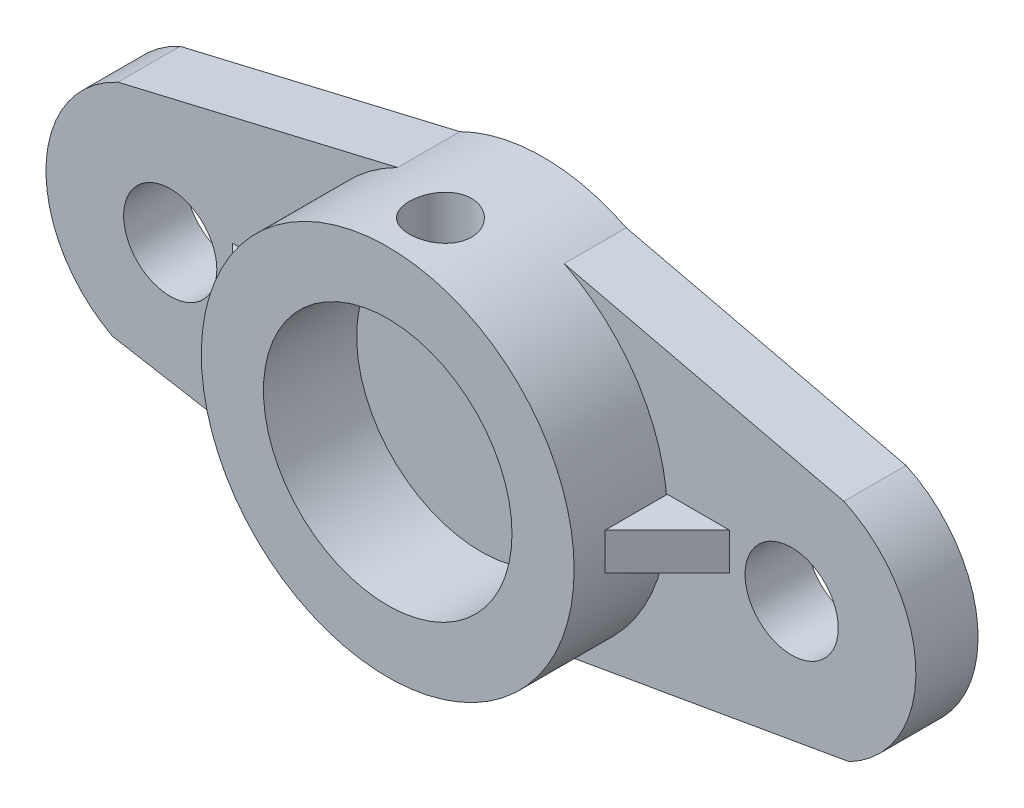
ISO-10303-21;
HEADER;
FILE_DESCRIPTION(('STEP AP214'),'2;1');
FILE_NAME('part.step','',(''),(''),'','','');
FILE_SCHEMA(('AUTOMOTIVE_DESIGN { 1 0 10303 214 1 1 1 1 }'));
ENDSEC;
DATA;
#1=APPLICATION_CONTEXT('core data for automotive mechanical design processes');
#2=APPLICATION_PROTOCOL_DEFINITION('international standard','automotive_design',2000,#1);
#3=PRODUCT_CONTEXT('',#1,'mechanical');
#4=PRODUCT('Part','Part','',(#3));
#5=PRODUCT_RELATED_PRODUCT_CATEGORY('part','',(#4));
#6=PRODUCT_DEFINITION_FORMATION('','',#4);
#7=PRODUCT_DEFINITION_CONTEXT('part definition',#1,'design');
#8=PRODUCT_DEFINITION('design','',#6,#7);
#9=PRODUCT_DEFINITION_SHAPE('','',#8);
#10=(LENGTH_UNIT() NAMED_UNIT(*) SI_UNIT(.MILLI.,.METRE.));
#11=(NAMED_UNIT(*) PLANE_ANGLE_UNIT() SI_UNIT($,.RADIAN.));
#12=(NAMED_UNIT(*) SI_UNIT($,.STERADIAN.) SOLID_ANGLE_UNIT());
#13=UNCERTAINTY_MEASURE_WITH_UNIT(LENGTH_MEASURE(1.E-05),#10,'distance_accuracy_value','');
#14=(GEOMETRIC_REPRESENTATION_CONTEXT(3) GLOBAL_UNCERTAINTY_ASSIGNED_CONTEXT((#13)) GLOBAL_UNIT_ASSIGNED_CONTEXT((#10,
#11,#12)) REPRESENTATION_CONTEXT('',''));
#15=CARTESIAN_POINT('',(0.,0.,0.));
#16=DIRECTION('',(0.,0.,1.));
#17=DIRECTION('',(1.,0.,0.));
#18=AXIS2_PLACEMENT_3D('',#15,#16,#17);
#19=CARTESIAN_POINT('',(30.,3.,10.));
#20=DIRECTION('',(1.,0.,0.));
#21=DIRECTION('',(0.,0.,-1.));
#22=AXIS2_PLACEMENT_3D('',#19,#20,#21);
#23=PLANE('',#22);
#24=DIRECTION('',(0.,0.,1.));
#25=VECTOR('',#24,1.);
#26=CARTESIAN_POINT('',(30.,-3.,10.));
#27=LINE('',#26,#25);
#28=CARTESIAN_POINT('',(30.,-3.,10.));
#29=VERTEX_POINT('',#28);
#30=CARTESIAN_POINT('',(30.,-3.,20.));
#31=VERTEX_POINT('',#30);
#32=EDGE_CURVE('E95',#29,#31,#27,.T.);
#33=ORIENTED_EDGE('',*,*,#32,.T.);
#34=DIRECTION('',(0.,-1.,0.));
#35=VECTOR('',#34,1.);
#36=CARTESIAN_POINT('',(30.,3.,20.));
#37=LINE('',#36,#35);
#38=CARTESIAN_POINT('',(30.,3.,20.));
#39=VERTEX_POINT('',#38);
#40=EDGE_CURVE('E12',#39,#31,#37,.T.);
#41=ORIENTED_EDGE('',*,*,#40,.F.);
#42=DIRECTION('',(0.,0.,1.));
#43=VECTOR('',#42,1.);
#44=CARTESIAN_POINT('',(30.,3.,10.));
#45=LINE('',#44,#43);
#46=CARTESIAN_POINT('',(30.,3.,10.));
#47=VERTEX_POINT('',#46);
#48=EDGE_CURVE('E88',#47,#39,#45,.T.);
#49=ORIENTED_EDGE('',*,*,#48,.F.);
#50=DIRECTION('',(0.,-1.,0.));
#51=VECTOR('',#50,1.);
#52=CARTESIAN_POINT('',(30.,3.,10.));
#53=LINE('',#52,#51);
#54=EDGE_CURVE('E96',#47,#29,#53,.T.);
#55=ORIENTED_EDGE('',*,*,#54,.T.);
#56=EDGE_LOOP('',(#33,#41,#49,#55));
#57=FACE_BOUND('',#56,.T.);
#58=ADVANCED_FACE('F48',(#57),#23,.F.);
#59=CARTESIAN_POINT('',(30.,3.,20.));
#60=DIRECTION('',(-0.707106781186547,0.,-0.707106781186548));
#61=DIRECTION('',(-0.707106781186548,0.,0.707106781186547));
#62=AXIS2_PLACEMENT_3D('',#59,#60,#61);
#63=PLANE('',#62);
#64=DIRECTION('',(0.707106781186548,0.,-0.707106781186547));
#65=VECTOR('',#64,1.);
#66=CARTESIAN_POINT('',(30.,-3.,20.));
#67=LINE('',#66,#65);
#68=CARTESIAN_POINT('',(40.,-3.,10.));
#69=VERTEX_POINT('',#68);
#70=EDGE_CURVE('E76',#31,#69,#67,.T.);
#71=ORIENTED_EDGE('',*,*,#70,.T.);
#72=DIRECTION('',(0.,-1.,0.));
#73=VECTOR('',#72,1.);
#74=CARTESIAN_POINT('',(40.,3.,10.));
#75=LINE('',#74,#73);
#76=CARTESIAN_POINT('',(40.,3.,10.));
#77=VERTEX_POINT('',#76);
#78=EDGE_CURVE('E56',#77,#69,#75,.T.);
#79=ORIENTED_EDGE('',*,*,#78,.F.);
#80=DIRECTION('',(0.707106781186548,0.,-0.707106781186547));
#81=VECTOR('',#80,1.);
#82=CARTESIAN_POINT('',(30.,3.,20.));
#83=LINE('',#82,#81);
#84=EDGE_CURVE('E84',#39,#77,#83,.T.);
#85=ORIENTED_EDGE('',*,*,#84,.F.);
#86=ORIENTED_EDGE('',*,*,#40,.T.);
#87=EDGE_LOOP('',(#71,#79,#85,#86));
#88=FACE_BOUND('',#87,.T.);
#89=ADVANCED_FACE('F85',(#88),#63,.F.);
#90=CARTESIAN_POINT('',(40.,3.,10.));
#91=DIRECTION('',(0.,0.,1.));
#92=DIRECTION('',(1.,0.,0.));
#93=AXIS2_PLACEMENT_3D('',#90,#91,#92);
#94=PLANE('',#93);
#95=DIRECTION('',(-1.,0.,0.));
#96=VECTOR('',#95,1.);
#97=CARTESIAN_POINT('',(40.,-3.,10.));
#98=LINE('',#97,#96);
#99=EDGE_CURVE('E81',#69,#29,#98,.T.);
#100=ORIENTED_EDGE('',*,*,#99,.T.);
#101=ORIENTED_EDGE('',*,*,#54,.F.);
#102=DIRECTION('',(-1.,0.,0.));
#103=VECTOR('',#102,1.);
#104=CARTESIAN_POINT('',(40.,3.,10.));
#105=LINE('',#104,#103);
#106=EDGE_CURVE('E64',#77,#47,#105,.T.);
#107=ORIENTED_EDGE('',*,*,#106,.F.);
#108=ORIENTED_EDGE('',*,*,#78,.T.);
#109=EDGE_LOOP('',(#100,#101,#107,#108));
#110=FACE_BOUND('',#109,.T.);
#111=ADVANCED_FACE('F103',(#110),#94,.F.);
#112=CARTESIAN_POINT('',(0.,3.,0.));
#113=DIRECTION('',(0.,-1.,0.));
#114=DIRECTION('',(0.,0.,-1.));
#115=AXIS2_PLACEMENT_3D('',#112,#113,#114);
#116=PLANE('',#115);
#117=ORIENTED_EDGE('',*,*,#48,.T.);
#118=ORIENTED_EDGE('',*,*,#84,.T.);
#119=ORIENTED_EDGE('',*,*,#106,.T.);
#120=EDGE_LOOP('',(#117,#118,#119));
#121=FACE_BOUND('',#120,.T.);
#122=ADVANCED_FACE('F91',(#121),#116,.F.);
#123=CARTESIAN_POINT('',(0.,-3.,0.));
#124=DIRECTION('',(0.,-1.,0.));
#125=DIRECTION('',(0.,0.,-1.));
#126=AXIS2_PLACEMENT_3D('',#123,#124,#125);
#127=PLANE('',#126);
#128=ORIENTED_EDGE('',*,*,#32,.F.);
#129=ORIENTED_EDGE('',*,*,#99,.F.);
#130=ORIENTED_EDGE('',*,*,#70,.F.);
#131=EDGE_LOOP('',(#128,#129,#130));
#132=FACE_BOUND('',#131,.T.);
#133=ADVANCED_FACE('F104',(#132),#127,.T.);
#134=CLOSED_SHELL('',(#58,#89,#111,#122,#133));
#135=MANIFOLD_SOLID_BREP('B2',#134);
#136=CARTESIAN_POINT('',(-40.,3.,10.));
#137=DIRECTION('',(0.,0.,1.));
#138=DIRECTION('',(1.,0.,0.));
#139=AXIS2_PLACEMENT_3D('',#136,#137,#138);
#140=PLANE('',#139);
#141=DIRECTION('',(-1.,0.,0.));
#142=VECTOR('',#141,1.);
#143=CARTESIAN_POINT('',(-40.,-3.,10.));
#144=LINE('',#143,#142);
#145=CARTESIAN_POINT('',(-30.,-3.,10.));
#146=VERTEX_POINT('',#145);
#147=CARTESIAN_POINT('',(-40.,-3.,10.));
#148=VERTEX_POINT('',#147);
#149=EDGE_CURVE('E202',#146,#148,#144,.T.);
#150=ORIENTED_EDGE('',*,*,#149,.T.);
#151=DIRECTION('',(0.,-1.,0.));
#152=VECTOR('',#151,1.);
#153=CARTESIAN_POINT('',(-40.,3.,10.));
#154=LINE('',#153,#152);
#155=CARTESIAN_POINT('',(-40.,3.,10.));
#156=VERTEX_POINT('',#155);
#157=EDGE_CURVE('E46',#156,#148,#154,.T.);
#158=ORIENTED_EDGE('',*,*,#157,.F.);
#159=DIRECTION('',(-1.,0.,0.));
#160=VECTOR('',#159,1.);
#161=CARTESIAN_POINT('',(-40.,3.,10.));
#162=LINE('',#161,#160);
#163=CARTESIAN_POINT('',(-30.,3.,10.));
#164=VERTEX_POINT('',#163);
#165=EDGE_CURVE('E195',#164,#156,#162,.T.);
#166=ORIENTED_EDGE('',*,*,#165,.F.);
#167=DIRECTION('',(0.,-1.,0.));
#168=VECTOR('',#167,1.);
#169=CARTESIAN_POINT('',(-30.,3.,10.));
#170=LINE('',#169,#168);
#171=EDGE_CURVE('E203',#164,#146,#170,.T.);
#172=ORIENTED_EDGE('',*,*,#171,.T.);
#173=EDGE_LOOP('',(#150,#158,#166,#172));
#174=FACE_BOUND('',#173,.T.);
#175=ADVANCED_FACE('F155',(#174),#140,.F.);
#176=CARTESIAN_POINT('',(-30.,3.,20.));
#177=DIRECTION('',(0.707106781186547,0.,-0.707106781186548));
#178=DIRECTION('',(-0.707106781186548,0.,-0.707106781186547));
#179=AXIS2_PLACEMENT_3D('',#176,#177,#178);
#180=PLANE('',#179);
#181=DIRECTION('',(0.707106781186548,0.,0.707106781186547));
#182=VECTOR('',#181,1.);
#183=CARTESIAN_POINT('',(-30.,-3.,20.));
#184=LINE('',#183,#182);
#185=CARTESIAN_POINT('',(-30.,-3.,20.));
#186=VERTEX_POINT('',#185);
#187=EDGE_CURVE('E183',#148,#186,#184,.T.);
#188=ORIENTED_EDGE('',*,*,#187,.T.);
#189=DIRECTION('',(0.,-1.,0.));
#190=VECTOR('',#189,1.);
#191=CARTESIAN_POINT('',(-30.,3.,20.));
#192=LINE('',#191,#190);
#193=CARTESIAN_POINT('',(-30.,3.,20.));
#194=VERTEX_POINT('',#193);
#195=EDGE_CURVE('E163',#194,#186,#192,.T.);
#196=ORIENTED_EDGE('',*,*,#195,.F.);
#197=DIRECTION('',(0.707106781186548,0.,0.707106781186547));
#198=VECTOR('',#197,1.);
#199=CARTESIAN_POINT('',(-30.,3.,20.));
#200=LINE('',#199,#198);
#201=EDGE_CURVE('E191',#156,#194,#200,.T.);
#202=ORIENTED_EDGE('',*,*,#201,.F.);
#203=ORIENTED_EDGE('',*,*,#157,.T.);
#204=EDGE_LOOP('',(#188,#196,#202,#203));
#205=FACE_BOUND('',#204,.T.);
#206=ADVANCED_FACE('F192',(#205),#180,.F.);
#207=CARTESIAN_POINT('',(-30.,3.,10.));
#208=DIRECTION('',(-1.,0.,0.));
#209=DIRECTION('',(0.,0.,1.));
#210=AXIS2_PLACEMENT_3D('',#207,#208,#209);
#211=PLANE('',#210);
#212=DIRECTION('',(0.,0.,-1.));
#213=VECTOR('',#212,1.);
#214=CARTESIAN_POINT('',(-30.,-3.,10.));
#215=LINE('',#214,#213);
#216=EDGE_CURVE('E188',#186,#146,#215,.T.);
#217=ORIENTED_EDGE('',*,*,#216,.T.);
#218=ORIENTED_EDGE('',*,*,#171,.F.);
#219=DIRECTION('',(0.,0.,-1.));
#220=VECTOR('',#219,1.);
#221=CARTESIAN_POINT('',(-30.,3.,10.));
#222=LINE('',#221,#220);
#223=EDGE_CURVE('E171',#194,#164,#222,.T.);
#224=ORIENTED_EDGE('',*,*,#223,.F.);
#225=ORIENTED_EDGE('',*,*,#195,.T.);
#226=EDGE_LOOP('',(#217,#218,#224,#225));
#227=FACE_BOUND('',#226,.T.);
#228=ADVANCED_FACE('F210',(#227),#211,.F.);
#229=CARTESIAN_POINT('',(0.,3.,0.));
#230=DIRECTION('',(0.,-1.,0.));
#231=DIRECTION('',(0.,0.,-1.));
#232=AXIS2_PLACEMENT_3D('',#229,#230,#231);
#233=PLANE('',#232);
#234=ORIENTED_EDGE('',*,*,#165,.T.);
#235=ORIENTED_EDGE('',*,*,#201,.T.);
#236=ORIENTED_EDGE('',*,*,#223,.T.);
#237=EDGE_LOOP('',(#234,#235,#236));
#238=FACE_BOUND('',#237,.T.);
#239=ADVANCED_FACE('F198',(#238),#233,.F.);
#240=CARTESIAN_POINT('',(0.,-3.,0.));
#241=DIRECTION('',(0.,-1.,0.));
#242=DIRECTION('',(0.,0.,-1.));
#243=AXIS2_PLACEMENT_3D('',#240,#241,#242);
#244=PLANE('',#243);
#245=ORIENTED_EDGE('',*,*,#149,.F.);
#246=ORIENTED_EDGE('',*,*,#216,.F.);
#247=ORIENTED_EDGE('',*,*,#187,.F.);
#248=EDGE_LOOP('',(#245,#246,#247));
#249=FACE_BOUND('',#248,.T.);
#250=ADVANCED_FACE('F211',(#249),#244,.T.);
#251=CLOSED_SHELL('',(#175,#206,#228,#239,#250));
#252=MANIFOLD_SOLID_BREP('B6',#251);
#253=CARTESIAN_POINT('',(0.,0.,10.));
#254=DIRECTION('',(0.,0.,1.));
#255=DIRECTION('',(1.,0.,0.));
#256=AXIS2_PLACEMENT_3D('',#253,#254,#255);
#257=PLANE('',#256);
#258=CARTESIAN_POINT('',(0.,0.,10.));
#259=DIRECTION('',(0.,0.,1.));
#260=DIRECTION('',(1.,0.,0.));
#261=AXIS2_PLACEMENT_3D('',#258,#259,#260);
#262=CIRCLE('',#261,30.);
#263=CARTESIAN_POINT('',(-13.4020982789799,26.8399657548322,10.));
#264=VERTEX_POINT('',#263);
#265=CARTESIAN_POINT('',(-10.1784328422696,-28.2205511086408,10.));
#266=VERTEX_POINT('',#265);
#267=EDGE_CURVE('E153',#264,#266,#262,.T.);
#268=ORIENTED_EDGE('',*,*,#267,.F.);
#269=DIRECTION('',(-0.973310208813478,-0.229493436549858,0.));
#270=VECTOR('',#269,1.);
#271=CARTESIAN_POINT('',(-6.70104913948995,28.4199828774161,10.));
#272=LINE('',#271,#270);
#273=CARTESIAN_POINT('',(-58.4131273482158,16.2269714081099,10.));
#274=VERTEX_POINT('',#273);
#275=EDGE_CURVE('E403',#264,#274,#272,.T.);
#276=ORIENTED_EDGE('',*,*,#275,.T.);
#277=CARTESIAN_POINT('',(-50.,-1.91742960770493,10.));
#278=DIRECTION('',(0.,0.,1.));
#279=DIRECTION('',(1.,0.,0.));
#280=AXIS2_PLACEMENT_3D('',#277,#278,#279);
#281=CIRCLE('',#280,20.);
#282=CARTESIAN_POINT('',(-59.2736487800074,-19.6374589052278,10.));
#283=VERTEX_POINT('',#282);
#284=EDGE_CURVE('E318',#274,#283,#281,.T.);
#285=ORIENTED_EDGE('',*,*,#284,.T.);
#286=DIRECTION('',(0.985059652243125,-0.172213476599983,0.));
#287=VECTOR('',#286,1.);
#288=CARTESIAN_POINT('',(-5.08921642113477,-29.1102755543204,10.));
#289=LINE('',#288,#287);
#290=EDGE_CURVE('E351',#283,#266,#289,.T.);
#291=ORIENTED_EDGE('',*,*,#290,.T.);
#292=EDGE_LOOP('',(#268,#276,#285,#291));
#293=FACE_BOUND('',#292,.T.);
#294=CARTESIAN_POINT('',(-50.,-1.91742960770493,10.));
#295=DIRECTION('',(0.,0.,1.));
#296=DIRECTION('',(1.,0.,0.));
#297=AXIS2_PLACEMENT_3D('',#294,#295,#296);
#298=CIRCLE('',#297,7.5);
#299=CARTESIAN_POINT('',(-42.5,-1.91742960770493,10.));
#300=VERTEX_POINT('',#299);
#301=EDGE_CURVE('E386',#300,#300,#298,.T.);
#302=ORIENTED_EDGE('',*,*,#301,.F.);
#303=EDGE_LOOP('',(#302));
#304=FACE_BOUND('',#303,.T.);
#305=ADVANCED_FACE('F253',(#293,#304),#257,.T.);
#306=CARTESIAN_POINT('',(-6.70104913948995,28.4199828774161,10.));
#307=DIRECTION('',(0.229493436549858,-0.973310208813478,0.));
#308=DIRECTION('',(0.973310208813478,0.229493436549858,0.));
#309=AXIS2_PLACEMENT_3D('',#306,#307,#308);
#310=PLANE('',#309);
#311=DIRECTION('',(-0.973310208813478,-0.229493436549858,0.));
#312=VECTOR('',#311,1.);
#313=CARTESIAN_POINT('',(-6.70104913948995,28.4199828774161,0.));
#314=LINE('',#313,#312);
#315=CARTESIAN_POINT('',(-13.4020982789799,26.8399657548322,0.));
#316=VERTEX_POINT('',#315);
#317=CARTESIAN_POINT('',(-58.4131273482158,16.2269714081099,0.));
#318=VERTEX_POINT('',#317);
#319=EDGE_CURVE('E366',#316,#318,#314,.T.);
#320=ORIENTED_EDGE('',*,*,#319,.T.);
#321=DIRECTION('',(0.,0.,-1.));
#322=VECTOR('',#321,1.);
#323=CARTESIAN_POINT('',(-58.4131273482158,16.2269714081099,10.));
#324=LINE('',#323,#322);
#325=EDGE_CURVE('E396',#274,#318,#324,.T.);
#326=ORIENTED_EDGE('',*,*,#325,.F.);
#327=ORIENTED_EDGE('',*,*,#275,.F.);
#328=DIRECTION('',(0.,0.,-1.));
#329=VECTOR('',#328,1.);
#330=CARTESIAN_POINT('',(-13.4020982789799,26.8399657548322,10.));
#331=LINE('',#330,#329);
#332=EDGE_CURVE('E362',#264,#316,#331,.T.);
#333=ORIENTED_EDGE('',*,*,#332,.T.);
#334=EDGE_LOOP('',(#320,#326,#327,#333));
#335=FACE_BOUND('',#334,.T.);
#336=ADVANCED_FACE('F417',(#335),#310,.F.);
#337=CARTESIAN_POINT('',(-50.,-1.91742960770493,10.));
#338=DIRECTION('',(0.,0.,-1.));
#339=DIRECTION('',(-1.,0.,0.));
#340=AXIS2_PLACEMENT_3D('',#337,#338,#339);
#341=CYLINDRICAL_SURFACE('',#340,20.);
#342=CARTESIAN_POINT('',(-50.,-1.91742960770493,0.));
#343=DIRECTION('',(0.,0.,1.));
#344=DIRECTION('',(1.,0.,0.));
#345=AXIS2_PLACEMENT_3D('',#342,#343,#344);
#346=CIRCLE('',#345,20.);
#347=CARTESIAN_POINT('',(-59.2736487800074,-19.6374589052278,0.));
#348=VERTEX_POINT('',#347);
#349=EDGE_CURVE('E370',#318,#348,#346,.T.);
#350=ORIENTED_EDGE('',*,*,#349,.T.);
#351=DIRECTION('',(0.,0.,-1.));
#352=VECTOR('',#351,1.);
#353=CARTESIAN_POINT('',(-59.2736487800074,-19.6374589052278,10.));
#354=LINE('',#353,#352);
#355=EDGE_CURVE('E394',#283,#348,#354,.T.);
#356=ORIENTED_EDGE('',*,*,#355,.F.);
#357=ORIENTED_EDGE('',*,*,#284,.F.);
#358=ORIENTED_EDGE('',*,*,#325,.T.);
#359=EDGE_LOOP('',(#350,#356,#357,#358));
#360=FACE_BOUND('',#359,.T.);
#361=ADVANCED_FACE('F422',(#360),#341,.T.);
#362=CARTESIAN_POINT('',(-5.08921642113477,-29.1102755543204,10.));
#363=DIRECTION('',(0.172213476599983,0.985059652243125,0.));
#364=DIRECTION('',(-0.985059652243125,0.172213476599983,0.));
#365=AXIS2_PLACEMENT_3D('',#362,#363,#364);
#366=PLANE('',#365);
#367=DIRECTION('',(0.985059652243125,-0.172213476599983,0.));
#368=VECTOR('',#367,1.);
#369=CARTESIAN_POINT('',(-5.08921642113477,-29.1102755543204,0.));
#370=LINE('',#369,#368);
#371=CARTESIAN_POINT('',(-10.1784328422696,-28.2205511086408,0.));
#372=VERTEX_POINT('',#371);
#373=EDGE_CURVE('E372',#348,#372,#370,.T.);
#374=ORIENTED_EDGE('',*,*,#373,.T.);
#375=DIRECTION('',(0.,0.,-1.));
#376=VECTOR('',#375,1.);
#377=CARTESIAN_POINT('',(-10.1784328422696,-28.2205511086408,10.));
#378=LINE('',#377,#376);
#379=EDGE_CURVE('E391',#266,#372,#378,.T.);
#380=ORIENTED_EDGE('',*,*,#379,.F.);
#381=ORIENTED_EDGE('',*,*,#290,.F.);
#382=ORIENTED_EDGE('',*,*,#355,.T.);
#383=EDGE_LOOP('',(#374,#380,#381,#382));
#384=FACE_BOUND('',#383,.T.);
#385=ADVANCED_FACE('F409',(#384),#366,.F.);
#386=CARTESIAN_POINT('',(5.08921642113477,-29.1102755543204,10.));
#387=DIRECTION('',(0.172213476599983,-0.985059652243125,0.));
#388=DIRECTION('',(0.985059652243125,0.172213476599983,0.));
#389=AXIS2_PLACEMENT_3D('',#386,#387,#388);
#390=PLANE('',#389);
#391=DIRECTION('',(-0.985059652243125,-0.172213476599983,0.));
#392=VECTOR('',#391,1.);
#393=CARTESIAN_POINT('',(5.08921642113477,-29.1102755543204,0.));
#394=LINE('',#393,#392);
#395=CARTESIAN_POINT('',(59.2736487800074,-19.6374589052278,0.));
#396=VERTEX_POINT('',#395);
#397=CARTESIAN_POINT('',(10.1784328422696,-28.2205511086408,0.));
#398=VERTEX_POINT('',#397);
#399=EDGE_CURVE('E335',#396,#398,#394,.T.);
#400=ORIENTED_EDGE('',*,*,#399,.F.);
#401=DIRECTION('',(0.,0.,-1.));
#402=VECTOR('',#401,1.);
#403=CARTESIAN_POINT('',(59.2736487800074,-19.6374589052278,10.));
#404=LINE('',#403,#402);
#405=CARTESIAN_POINT('',(59.2736487800074,-19.6374589052278,10.));
#406=VERTEX_POINT('',#405);
#407=EDGE_CURVE('E330',#406,#396,#404,.T.);
#408=ORIENTED_EDGE('',*,*,#407,.F.);
#409=DIRECTION('',(-0.985059652243125,-0.172213476599983,0.));
#410=VECTOR('',#409,1.);
#411=CARTESIAN_POINT('',(5.08921642113477,-29.1102755543204,10.));
#412=LINE('',#411,#410);
#413=CARTESIAN_POINT('',(10.1784328422696,-28.2205511086408,10.));
#414=VERTEX_POINT('',#413);
#415=EDGE_CURVE('E333',#406,#414,#412,.T.);
#416=ORIENTED_EDGE('',*,*,#415,.T.);
#417=DIRECTION('',(0.,0.,-1.));
#418=VECTOR('',#417,1.);
#419=CARTESIAN_POINT('',(10.1784328422696,-28.2205511086408,10.));
#420=LINE('',#419,#418);
#421=EDGE_CURVE('E340',#414,#398,#420,.T.);
#422=ORIENTED_EDGE('',*,*,#421,.T.);
#423=EDGE_LOOP('',(#400,#408,#416,#422));
#424=FACE_BOUND('',#423,.T.);
#425=ADVANCED_FACE('F332',(#424),#390,.T.);
#426=CARTESIAN_POINT('',(50.,-1.91742960770493,10.));
#427=DIRECTION('',(0.,0.,-1.));
#428=DIRECTION('',(-1.,0.,0.));
#429=AXIS2_PLACEMENT_3D('',#426,#427,#428);
#430=CYLINDRICAL_SURFACE('',#429,20.);
#431=CARTESIAN_POINT('',(50.,-1.91742960770493,0.));
#432=DIRECTION('',(0.,0.,1.));
#433=DIRECTION('',(1.,0.,0.));
#434=AXIS2_PLACEMENT_3D('',#431,#432,#433);
#435=CIRCLE('',#434,20.);
#436=CARTESIAN_POINT('',(58.4131273482158,16.2269714081099,0.));
#437=VERTEX_POINT('',#436);
#438=EDGE_CURVE('E378',#437,#396,#435,.F.);
#439=ORIENTED_EDGE('',*,*,#438,.F.);
#440=DIRECTION('',(0.,0.,-1.));
#441=VECTOR('',#440,1.);
#442=CARTESIAN_POINT('',(58.4131273482158,16.2269714081099,10.));
#443=LINE('',#442,#441);
#444=CARTESIAN_POINT('',(58.4131273482158,16.2269714081099,10.));
#445=VERTEX_POINT('',#444);
#446=EDGE_CURVE('E341',#445,#437,#443,.T.);
#447=ORIENTED_EDGE('',*,*,#446,.F.);
#448=CARTESIAN_POINT('',(50.,-1.91742960770493,10.));
#449=DIRECTION('',(0.,0.,1.));
#450=DIRECTION('',(1.,0.,0.));
#451=AXIS2_PLACEMENT_3D('',#448,#449,#450);
#452=CIRCLE('',#451,20.);
#453=EDGE_CURVE('E348',#445,#406,#452,.F.);
#454=ORIENTED_EDGE('',*,*,#453,.T.);
#455=ORIENTED_EDGE('',*,*,#407,.T.);
#456=EDGE_LOOP('',(#439,#447,#454,#455));
#457=FACE_BOUND('',#456,.T.);
#458=ADVANCED_FACE('F353',(#457),#430,.T.);
#459=CARTESIAN_POINT('',(6.70104913948995,28.4199828774161,10.));
#460=DIRECTION('',(0.229493436549858,0.973310208813478,0.));
#461=DIRECTION('',(-0.973310208813478,0.229493436549858,0.));
#462=AXIS2_PLACEMENT_3D('',#459,#460,#461);
#463=PLANE('',#462);
#464=DIRECTION('',(0.973310208813478,-0.229493436549858,0.));
#465=VECTOR('',#464,1.);
#466=CARTESIAN_POINT('',(6.70104913948995,28.4199828774161,0.));
#467=LINE('',#466,#465);
#468=CARTESIAN_POINT('',(13.4020982789799,26.8399657548322,0.));
#469=VERTEX_POINT('',#468);
#470=EDGE_CURVE('E380',#469,#437,#467,.T.);
#471=ORIENTED_EDGE('',*,*,#470,.F.);
#472=DIRECTION('',(0.,0.,-1.));
#473=VECTOR('',#472,1.);
#474=CARTESIAN_POINT('',(13.4020982789799,26.8399657548322,10.));
#475=LINE('',#474,#473);
#476=CARTESIAN_POINT('',(13.4020982789799,26.8399657548322,10.));
#477=VERTEX_POINT('',#476);
#478=EDGE_CURVE('E306',#477,#469,#475,.T.);
#479=ORIENTED_EDGE('',*,*,#478,.F.);
#480=DIRECTION('',(0.973310208813478,-0.229493436549858,0.));
#481=VECTOR('',#480,1.);
#482=CARTESIAN_POINT('',(6.70104913948995,28.4199828774161,10.));
#483=LINE('',#482,#481);
#484=EDGE_CURVE('E354',#477,#445,#483,.T.);
#485=ORIENTED_EDGE('',*,*,#484,.T.);
#486=ORIENTED_EDGE('',*,*,#446,.T.);
#487=EDGE_LOOP('',(#471,#479,#485,#486));
#488=FACE_BOUND('',#487,.T.);
#489=ADVANCED_FACE('F461',(#488),#463,.T.);
#490=CARTESIAN_POINT('',(0.,0.,10.));
#491=DIRECTION('',(0.,0.,-1.));
#492=DIRECTION('',(-1.,0.,0.));
#493=AXIS2_PLACEMENT_3D('',#490,#491,#492);
#494=CYLINDRICAL_SURFACE('',#493,30.);
#495=CARTESIAN_POINT('',(0.,30.,21.5172991938224));
#496=CARTESIAN_POINT('',(-0.139438730306518,30.0000009341092,21.5173013424254));
#497=CARTESIAN_POINT('',(-0.278848374995361,29.9990260400444,21.5114644381739));
#498=CARTESIAN_POINT('',(-0.556708896140974,29.9951557115238,21.4881650103199));
#499=CARTESIAN_POINT('',(-0.695159577308833,29.9922598968632,21.4707001852182));
#500=CARTESIAN_POINT('',(-0.970150520344155,29.9846251699259,21.4242603809244));
#501=CARTESIAN_POINT('',(-1.10668952072418,29.979885095025,21.3952781408909));
#502=CARTESIAN_POINT('',(-1.37685247096437,29.9686930297133,21.3260131384166));
#503=CARTESIAN_POINT('',(-1.51047533178691,29.9622404112013,21.2857262295061));
#504=CARTESIAN_POINT('',(-1.77365528085701,29.9478128865368,21.1942141924615));
#505=CARTESIAN_POINT('',(-1.90321704710935,29.9398398129292,21.1430022231447));
#506=CARTESIAN_POINT('',(-2.15759207174615,29.9225843720656,21.0299674254484));
#507=CARTESIAN_POINT('',(-2.28240355940392,29.9133015225275,20.9681406867011));
#508=CARTESIAN_POINT('',(-2.52631223217171,29.8936901460056,20.8343680814399));
#509=CARTESIAN_POINT('',(-2.64541222152925,29.8833621400859,20.7624272504239));
#510=CARTESIAN_POINT('',(-2.87720075943645,29.8619368035706,20.6088818713996));
#511=CARTESIAN_POINT('',(-2.98988690101178,29.8508391875783,20.5272737304059));
#512=CARTESIAN_POINT('',(-3.20893550320274,29.8280901061561,20.354273242162));
#513=CARTESIAN_POINT('',(-3.3152386019937,29.8164348485225,20.2628062234685));
#514=CARTESIAN_POINT('',(-3.51981905081324,29.792977049997,20.0712433000943));
#515=CARTESIAN_POINT('',(-3.6180934149484,29.7811744561748,19.971144213332));
#516=CARTESIAN_POINT('',(-3.80586900468401,29.757760553176,19.7630647595512));
#517=CARTESIAN_POINT('',(-3.89537288715651,29.7461491869625,19.6550867967085));
#518=CARTESIAN_POINT('',(-4.06505128766863,29.7234367117224,19.4319199512322));
#519=CARTESIAN_POINT('',(-4.14522235269035,29.7123357924676,19.3167284237654));
#520=CARTESIAN_POINT('',(-4.29606801839333,29.6909016370194,19.0792706685162));
#521=CARTESIAN_POINT('',(-4.36668480543058,29.6805732300208,18.9569672620451));
#522=CARTESIAN_POINT('',(-4.49737903615683,29.6610510502017,18.7067101071732));
#523=CARTESIAN_POINT('',(-4.55745254274493,29.6518577016161,18.5787542702572));
#524=CARTESIAN_POINT('',(-4.66655756396113,29.6348831234285,18.3181798828075));
#525=CARTESIAN_POINT('',(-4.7155937427807,29.6271012976113,18.1855633293101));
#526=CARTESIAN_POINT('',(-4.80229722760728,29.6131700678879,17.9165668840875));
#527=CARTESIAN_POINT('',(-4.83996038282925,29.6070212600786,17.7801856381433));
#528=CARTESIAN_POINT('',(-4.93477467758659,29.5914227981395,17.3694977179667));
#529=CARTESIAN_POINT('',(-4.97488357358493,29.5846386003063,17.0909303284527));
#530=CARTESIAN_POINT('',(-5.00784793424048,29.5790755483693,16.531096035438));
#531=CARTESIAN_POINT('',(-5.00070674304215,29.5802961277241,16.24982932439));
#532=CARTESIAN_POINT('',(-4.93978637434362,29.590529429811,15.6954547152496));
#533=CARTESIAN_POINT('',(-4.88648873937526,29.5994616948564,15.4222926000829));
#534=CARTESIAN_POINT('',(-4.73550730524632,29.6239896757343,14.8888535447099));
#535=CARTESIAN_POINT('',(-4.63782198375658,29.6395856201047,14.6285770467709));
#536=CARTESIAN_POINT('',(-4.40035421574883,29.6757696483376,14.1268423601035));
#537=CARTESIAN_POINT('',(-4.26037175365461,29.6963813586744,13.8854805996435));
#538=CARTESIAN_POINT('',(-3.94242410922567,29.7402583517709,13.4294901747445));
#539=CARTESIAN_POINT('',(-3.76445586128014,29.7635238486315,13.214863670167));
#540=CARTESIAN_POINT('',(-3.37296440409906,29.8104405621052,12.8156470816813));
#541=CARTESIAN_POINT('',(-3.15902792232791,29.8340929858411,12.6314621726728));
#542=CARTESIAN_POINT('',(-2.70307050338167,29.8788520267263,12.3015436525611));
#543=CARTESIAN_POINT('',(-2.46104938526711,29.8999586274719,12.1558102892074));
#544=CARTESIAN_POINT('',(-1.95541183087794,29.9372778581815,11.906894743802));
#545=CARTESIAN_POINT('',(-1.6917774507324,29.9534863682324,11.8037483562182));
#546=CARTESIAN_POINT('',(-1.15059669160235,29.9791500601698,11.6433107622722));
#547=CARTESIAN_POINT('',(-0.87305147849117,29.988605806999,11.5860157198937));
#548=CARTESIAN_POINT('',(-0.315419802472562,29.999622596864,11.5194564768817));
#549=CARTESIAN_POINT('',(-0.0354014741699753,30.0012750602153,11.5096360491043));
#550=CARTESIAN_POINT('',(0.522279545647737,29.9967494884638,11.5368218837856));
#551=CARTESIAN_POINT('',(0.799942327386604,29.9905717546544,11.5738263444989));
#552=CARTESIAN_POINT('',(1.3433123514886,29.971136538593,11.6931488881111));
#553=CARTESIAN_POINT('',(1.60908173821583,29.9579220953842,11.7751915942199));
#554=CARTESIAN_POINT('',(2.12309376827574,29.9258892897492,11.9819682466052));
#555=CARTESIAN_POINT('',(2.37133542643381,29.9070706126377,12.1067045902467));
#556=CARTESIAN_POINT('',(2.84566138437114,29.8656903236297,12.3966013815219));
#557=CARTESIAN_POINT('',(3.07153052223238,29.8430971086773,12.5621092749647));
#558=CARTESIAN_POINT('',(3.49248715064582,29.7967693569018,12.9283740558016));
#559=CARTESIAN_POINT('',(3.68757240338597,29.7730347372687,13.1291335035424));
#560=CARTESIAN_POINT('',(4.04348563611056,29.7268034705286,13.5626934178571));
#561=CARTESIAN_POINT('',(4.20393781021313,29.7043221945332,13.7958042543743));
#562=CARTESIAN_POINT('',(4.48340433261341,29.6634307237625,14.2860084024728));
#563=CARTESIAN_POINT('',(4.60241999444133,29.6450203999454,14.5431009535102));
#564=CARTESIAN_POINT('',(4.79507773356378,29.6144685973239,15.0728665011));
#565=CARTESIAN_POINT('',(4.86890685306042,29.602301310812,15.3454700950138));
#566=CARTESIAN_POINT('',(4.96966691993878,29.5855561119601,15.8995847371978));
#567=CARTESIAN_POINT('',(4.99660194454599,29.580977539818,16.1810950089062));
#568=CARTESIAN_POINT('',(5.0012321244509,29.5801885462874,16.60170897724));
#569=CARTESIAN_POINT('',(4.99693975789018,29.5809172344068,16.7408361158468));
#570=CARTESIAN_POINT('',(4.97678436801742,29.5843160283654,17.0182117783081));
#571=CARTESIAN_POINT('',(4.96092569221815,29.5869854047428,17.1564606126077));
#572=CARTESIAN_POINT('',(4.91774640529922,29.5941926651669,17.4311469830993));
#573=CARTESIAN_POINT('',(4.89042170080803,29.5987312164982,17.5675838544573));
#574=CARTESIAN_POINT('',(4.82453301754958,29.6095423170401,17.8375956486979));
#575=CARTESIAN_POINT('',(4.78597308458851,29.615814242021,17.9711715832486));
#576=CARTESIAN_POINT('',(4.6979342864003,29.6299071307843,18.2344677989441));
#577=CARTESIAN_POINT('',(4.64846435664851,29.6377268263817,18.3641911373435));
#578=CARTESIAN_POINT('',(4.53896986674982,29.6546930297384,18.6189579202603));
#579=CARTESIAN_POINT('',(4.47894908739059,29.6638390620139,18.7440030217735));
#580=CARTESIAN_POINT('',(4.34874498523013,29.6832065043881,18.988660644622));
#581=CARTESIAN_POINT('',(4.27855767862003,29.6934283356131,19.1082710120779));
#582=CARTESIAN_POINT('',(4.12855715704193,29.7146554589665,19.3411607194542));
#583=CARTESIAN_POINT('',(4.04874732556529,29.7256604751555,19.4544422643436));
#584=CARTESIAN_POINT('',(3.87899685367998,29.7482907408856,19.6753078925246));
#585=CARTESIAN_POINT('',(3.78894418512202,29.7599219326499,19.7828052839265));
#586=CARTESIAN_POINT('',(3.60017574898997,29.783347263822,19.9898125903015));
#587=CARTESIAN_POINT('',(3.50146308651917,29.7951413435574,20.0893253439187));
#588=CARTESIAN_POINT('',(3.29596225179814,29.8185735949796,20.2797811237998));
#589=CARTESIAN_POINT('',(3.18916929766622,29.8302116694714,20.3707190028536));
#590=CARTESIAN_POINT('',(2.96833108680549,29.8529952569281,20.5432949099274));
#591=CARTESIAN_POINT('',(2.8542885214692,29.8641409501131,20.624936358157));
#592=CARTESIAN_POINT('',(2.61883824287209,29.8857116363867,20.778944224233));
#593=CARTESIAN_POINT('',(2.49738284629917,29.896130775176,20.8512385927547));
#594=CARTESIAN_POINT('',(2.24876507402075,29.9158586577262,20.9852959410084));
#595=CARTESIAN_POINT('',(2.1216048197654,29.925167809621,21.047062795239));
#596=CARTESIAN_POINT('',(1.86251821435404,29.9424090895346,21.1595999000905));
#597=CARTESIAN_POINT('',(1.73059524615479,29.950342172599,21.2103777835971));
#598=CARTESIAN_POINT('',(1.46288984328885,29.9646113279921,21.3005940127178));
#599=CARTESIAN_POINT('',(1.32710824358209,29.9709477429356,21.3400347913164));
#600=CARTESIAN_POINT('',(0.995492141379857,29.9841083147641,21.4212774949925));
#601=CARTESIAN_POINT('',(0.798161887183511,29.9900398634941,21.4572428508542));
#602=CARTESIAN_POINT('',(0.400534394814458,29.9979850016837,21.5052519516212));
#603=CARTESIAN_POINT('',(0.200237207783449,29.9999986585978,21.5172961083794));
#604=CARTESIAN_POINT('',(0.,30.,21.5172991938224));
#605=B_SPLINE_CURVE_WITH_KNOTS('',3,(#495,#496,#497,#498,#499,#500,#501,#502,#503,#504,#505,
#506,#507,#508,#509,#510,#511,#512,#513,#514,#515,#516,#517,#518,#519,#520,#521,#522,#523,#524,
#525,#526,#527,#528,#529,#530,#531,#532,#533,#534,#535,#536,#537,#538,#539,#540,#541,#542,#543,
#544,#545,#546,#547,#548,#549,#550,#551,#552,#553,#554,#555,#556,#557,#558,#559,#560,#561,#562,
#563,#564,#565,#566,#567,#568,#569,#570,#571,#572,#573,#574,#575,#576,#577,#578,#579,#580,#581,
#582,#583,#584,#585,#586,#587,#588,#589,#590,#591,#592,#593,#594,#595,#596,#597,#598,#599,#600,
#601,#602,#603,#604),.UNSPECIFIED.,.T.,.F.,(4,2,2,2,2,2,2,2,2,2,2,2,2,2,2,2,2,2,2,2,2,2,2,2,2,2,
2,2,2,2,2,2,2,2,2,2,2,2,2,2,2,2,2,2,2,2,2,2,2,2,2,2,2,2,4),(0.,0.418140677636319,
0.836364141924732,1.25485168316257,1.67349292366114,2.09163274536574,2.50992693714591,
2.92801360569262,3.3462561521736,3.767924736377,4.18974943231197,4.61144594582073,
5.03329798883921,5.45759827861687,5.88205667621393,6.30633536657102,6.73076871826474,
7.57090272280958,8.41097726715884,9.24239161594928,10.0738344812487,10.9092723133923,
11.7447775943526,12.5906365789676,13.4365010134581,14.2830749590592,15.1295780711641,
15.9661388505691,16.8026674414583,17.6341373208694,18.4656538972624,19.3045176932816,
20.1434424418268,20.9910576208935,21.83864592826,22.6827016275766,23.5266839364735,
23.943862966713,24.3608852695982,24.7780565762499,25.1950778447662,25.6117588257789,
26.0282907967259,26.4449864317718,26.861535972448,27.2831832626947,27.7046799813851,
28.1264281209232,28.5480205921467,28.9726903230862,29.3972034214198,29.8214207018257,
30.2455468755531,30.8460167962321,31.4464763784911),.UNSPECIFIED.);
#606=CARTESIAN_POINT('',(0.,30.,21.5172991938224));
#607=VERTEX_POINT('',#606);
#608=EDGE_CURVE('E465',#607,#607,#605,.T.);
#609=ORIENTED_EDGE('',*,*,#608,.T.);
#610=EDGE_LOOP('',(#609));
#611=FACE_BOUND('',#610,.T.);
#612=CARTESIAN_POINT('',(0.,0.,0.));
#613=DIRECTION('',(0.,0.,1.));
#614=DIRECTION('',(1.,0.,0.));
#615=AXIS2_PLACEMENT_3D('',#612,#613,#614);
#616=CIRCLE('',#615,30.);
#617=EDGE_CURVE('E309',#469,#316,#616,.T.);
#618=ORIENTED_EDGE('',*,*,#617,.T.);
#619=ORIENTED_EDGE('',*,*,#332,.F.);
#620=ORIENTED_EDGE('',*,*,#267,.T.);
#621=ORIENTED_EDGE('',*,*,#379,.T.);
#622=EDGE_CURVE('E374',#372,#398,#616,.T.);
#623=ORIENTED_EDGE('',*,*,#622,.T.);
#624=ORIENTED_EDGE('',*,*,#421,.F.);
#625=EDGE_CURVE('E268',#414,#477,#262,.T.);
#626=ORIENTED_EDGE('',*,*,#625,.T.);
#627=ORIENTED_EDGE('',*,*,#478,.T.);
#628=EDGE_LOOP('',(#618,#619,#620,#621,#623,#624,#626,#627));
#629=FACE_BOUND('',#628,.T.);
#630=CARTESIAN_POINT('',(0.,0.,25.));
#631=DIRECTION('',(0.,0.,1.));
#632=DIRECTION('',(1.,0.,0.));
#633=AXIS2_PLACEMENT_3D('',#630,#631,#632);
#634=CIRCLE('',#633,30.);
#635=CARTESIAN_POINT('',(30.,0.,25.));
#636=VERTEX_POINT('',#635);
#637=EDGE_CURVE('E367',#636,#636,#634,.T.);
#638=ORIENTED_EDGE('',*,*,#637,.F.);
#639=EDGE_LOOP('',(#638));
#640=FACE_BOUND('',#639,.T.);
#641=ADVANCED_FACE('F412',(#611,#629,#640),#494,.T.);
#642=CARTESIAN_POINT('',(-50.,-1.91742960770493,10.));
#643=DIRECTION('',(0.,0.,-1.));
#644=DIRECTION('',(-1.,0.,0.));
#645=AXIS2_PLACEMENT_3D('',#642,#643,#644);
#646=CYLINDRICAL_SURFACE('',#645,7.5);
#647=ORIENTED_EDGE('',*,*,#301,.T.);
#648=EDGE_LOOP('',(#647));
#649=FACE_BOUND('',#648,.T.);
#650=CARTESIAN_POINT('',(-50.,-1.91742960770493,0.));
#651=DIRECTION('',(0.,0.,1.));
#652=DIRECTION('',(1.,0.,0.));
#653=AXIS2_PLACEMENT_3D('',#650,#651,#652);
#654=CIRCLE('',#653,7.5);
#655=CARTESIAN_POINT('',(-42.5,-1.91742960770493,0.));
#656=VERTEX_POINT('',#655);
#657=EDGE_CURVE('E363',#656,#656,#654,.T.);
#658=ORIENTED_EDGE('',*,*,#657,.F.);
#659=EDGE_LOOP('',(#658));
#660=FACE_BOUND('',#659,.T.);
#661=ADVANCED_FACE('F255',(#649,#660),#646,.F.);
#662=CARTESIAN_POINT('',(50.,-1.91742960770493,10.));
#663=DIRECTION('',(0.,0.,-1.));
#664=DIRECTION('',(-1.,0.,0.));
#665=AXIS2_PLACEMENT_3D('',#662,#663,#664);
#666=CYLINDRICAL_SURFACE('',#665,7.5);
#667=CARTESIAN_POINT('',(50.,-1.91742960770493,10.));
#668=DIRECTION('',(0.,0.,1.));
#669=DIRECTION('',(1.,0.,0.));
#670=AXIS2_PLACEMENT_3D('',#667,#668,#669);
#671=CIRCLE('',#670,7.5);
#672=CARTESIAN_POINT('',(57.5,-1.91742960770493,10.));
#673=VERTEX_POINT('',#672);
#674=EDGE_CURVE('E356',#673,#673,#671,.F.);
#675=ORIENTED_EDGE('',*,*,#674,.F.);
#676=EDGE_LOOP('',(#675));
#677=FACE_BOUND('',#676,.T.);
#678=CARTESIAN_POINT('',(50.,-1.91742960770493,0.));
#679=DIRECTION('',(0.,0.,1.));
#680=DIRECTION('',(1.,0.,0.));
#681=AXIS2_PLACEMENT_3D('',#678,#679,#680);
#682=CIRCLE('',#681,7.5);
#683=CARTESIAN_POINT('',(57.5,-1.91742960770493,0.));
#684=VERTEX_POINT('',#683);
#685=EDGE_CURVE('E383',#684,#684,#682,.F.);
#686=ORIENTED_EDGE('',*,*,#685,.T.);
#687=EDGE_LOOP('',(#686));
#688=FACE_BOUND('',#687,.T.);
#689=ADVANCED_FACE('F442',(#677,#688),#666,.F.);
#690=ORIENTED_EDGE('',*,*,#625,.F.);
#691=ORIENTED_EDGE('',*,*,#415,.F.);
#692=ORIENTED_EDGE('',*,*,#453,.F.);
#693=ORIENTED_EDGE('',*,*,#484,.F.);
#694=EDGE_LOOP('',(#690,#691,#692,#693));
#695=FACE_BOUND('',#694,.T.);
#696=ORIENTED_EDGE('',*,*,#674,.T.);
#697=EDGE_LOOP('',(#696));
#698=FACE_BOUND('',#697,.T.);
#699=ADVANCED_FACE('F345',(#695,#698),#257,.T.);
#700=CARTESIAN_POINT('',(0.,0.,0.));
#701=DIRECTION('',(0.,0.,1.));
#702=DIRECTION('',(1.,0.,0.));
#703=AXIS2_PLACEMENT_3D('',#700,#701,#702);
#704=PLANE('',#703);
#705=ORIENTED_EDGE('',*,*,#657,.T.);
#706=EDGE_LOOP('',(#705));
#707=FACE_BOUND('',#706,.T.);
#708=ORIENTED_EDGE('',*,*,#319,.F.);
#709=ORIENTED_EDGE('',*,*,#617,.F.);
#710=ORIENTED_EDGE('',*,*,#470,.T.);
#711=ORIENTED_EDGE('',*,*,#438,.T.);
#712=ORIENTED_EDGE('',*,*,#399,.T.);
#713=ORIENTED_EDGE('',*,*,#622,.F.);
#714=ORIENTED_EDGE('',*,*,#373,.F.);
#715=ORIENTED_EDGE('',*,*,#349,.F.);
#716=EDGE_LOOP('',(#708,#709,#710,#711,#712,#713,#714,#715));
#717=FACE_BOUND('',#716,.T.);
#718=ORIENTED_EDGE('',*,*,#685,.F.);
#719=EDGE_LOOP('',(#718));
#720=FACE_BOUND('',#719,.T.);
#721=ADVANCED_FACE('F419',(#707,#717,#720),#704,.F.);
#722=CARTESIAN_POINT('',(0.,0.,25.));
#723=DIRECTION('',(0.,0.,1.));
#724=DIRECTION('',(1.,0.,0.));
#725=AXIS2_PLACEMENT_3D('',#722,#723,#724);
#726=PLANE('',#725);
#727=ORIENTED_EDGE('',*,*,#637,.T.);
#728=EDGE_LOOP('',(#727));
#729=FACE_BOUND('',#728,.T.);
#730=CARTESIAN_POINT('',(0.,0.,25.));
#731=DIRECTION('',(0.,0.,1.));
#732=DIRECTION('',(1.,0.,0.));
#733=AXIS2_PLACEMENT_3D('',#730,#731,#732);
#734=CIRCLE('',#733,20.);
#735=CARTESIAN_POINT('',(20.,0.,25.));
#736=VERTEX_POINT('',#735);
#737=EDGE_CURVE('E472',#736,#736,#734,.T.);
#738=ORIENTED_EDGE('',*,*,#737,.F.);
#739=EDGE_LOOP('',(#738));
#740=FACE_BOUND('',#739,.T.);
#741=ADVANCED_FACE('F447',(#729,#740),#726,.T.);
#742=CARTESIAN_POINT('',(0.,0.,25.));
#743=DIRECTION('',(0.,0.,-1.));
#744=DIRECTION('',(-1.,0.,0.));
#745=AXIS2_PLACEMENT_3D('',#742,#743,#744);
#746=CYLINDRICAL_SURFACE('',#745,20.);
#747=CARTESIAN_POINT('',(0.,20.,21.5172991938224));
#748=CARTESIAN_POINT('',(-0.276253628899103,19.9999953289337,21.5172914413619));
#749=CARTESIAN_POINT('',(-0.552593859435877,19.9942192710609,21.4943273579098));
#750=CARTESIAN_POINT('',(-1.09735441256844,19.9717371276631,21.4032153561324));
#751=CARTESIAN_POINT('',(-1.3657701562358,19.9550248473325,21.3350418286963));
#752=CARTESIAN_POINT('',(-1.88673624060859,19.9125208777344,21.1558350156155));
#753=CARTESIAN_POINT('',(-2.13930521143334,19.8867400947353,21.0448531981049));
#754=CARTESIAN_POINT('',(-2.62224043968142,19.8288447935874,20.7833612270063));
#755=CARTESIAN_POINT('',(-2.85260594782921,19.7967300618052,20.6328497400926));
#756=CARTESIAN_POINT('',(-3.28933975766972,19.7289137863898,20.2932965616418));
#757=CARTESIAN_POINT('',(-3.49518563353685,19.6931569049375,20.1035939439589));
#758=CARTESIAN_POINT('',(-3.87249642401106,19.6224540039312,19.6924585107923));
#759=CARTESIAN_POINT('',(-4.04395745649731,19.5875080763289,19.4710221173327));
#760=CARTESIAN_POINT('',(-4.35008847599658,19.5218258566056,18.9986484380325));
#761=CARTESIAN_POINT('',(-4.4841740530838,19.4911598154937,18.7473217577933));
#762=CARTESIAN_POINT('',(-4.70798969516915,19.4383164939339,18.224804488289));
#763=CARTESIAN_POINT('',(-4.79772685146714,19.4161378564806,17.9536170827157));
#764=CARTESIAN_POINT('',(-4.92851612268255,19.3833492232108,17.4048208664836));
#765=CARTESIAN_POINT('',(-4.97050756110685,19.372516366567,17.1274495403625));
#766=CARTESIAN_POINT('',(-5.00753925022136,19.362978748653,16.5694039638246));
#767=CARTESIAN_POINT('',(-5.00258713939371,19.3642720142643,16.288730258182));
#768=CARTESIAN_POINT('',(-4.94662174879902,19.3786401838939,15.7392465013379));
#769=CARTESIAN_POINT('',(-4.89672780063545,19.3914287669098,15.470313788938));
#770=CARTESIAN_POINT('',(-4.75408062300998,19.426890322369,14.9447623574522));
#771=CARTESIAN_POINT('',(-4.66132434023131,19.4495639989746,14.6881445170594));
#772=CARTESIAN_POINT('',(-4.43463159312395,19.5025037968553,14.1915058063153));
#773=CARTESIAN_POINT('',(-4.3002888907764,19.5328442489939,13.9516786211905));
#774=CARTESIAN_POINT('',(-3.99452092004983,19.5976570281997,13.4975701612997));
#775=CARTESIAN_POINT('',(-3.82308916269613,19.6321300778209,13.2832933669316));
#776=CARTESIAN_POINT('',(-3.44221141560407,19.7025293513297,12.8799538081744));
#777=CARTESIAN_POINT('',(-3.23182086055287,19.7384689826,12.6917842269513));
#778=CARTESIAN_POINT('',(-2.78203972501233,19.8068655192919,12.3532283856094));
#779=CARTESIAN_POINT('',(-2.54264825902648,19.8393223183136,12.2028432796106));
#780=CARTESIAN_POINT('',(-2.04038629560464,19.897257736473,11.9437972397412));
#781=CARTESIAN_POINT('',(-1.77743797736208,19.9227120042576,11.8352813929743));
#782=CARTESIAN_POINT('',(-1.23625336047628,19.9635972330472,11.6642415081239));
#783=CARTESIAN_POINT('',(-0.958019997168286,19.9790301113094,11.6017086724286));
#784=CARTESIAN_POINT('',(-0.401799901300094,19.9978499757125,11.525773975293));
#785=CARTESIAN_POINT('',(-0.123989066627371,20.0015351169426,11.5111557735714));
#786=CARTESIAN_POINT('',(0.430109582671691,19.9972934938151,11.5281292006741));
#787=CARTESIAN_POINT('',(0.706397532148651,19.9893677747284,11.5597166698196));
#788=CARTESIAN_POINT('',(1.24538089592163,19.9629860375783,11.6672022217937));
#789=CARTESIAN_POINT('',(1.50821706322917,19.9446878061929,11.7424367387457));
#790=CARTESIAN_POINT('',(2.01752430817505,19.899623554472,11.9343228072506));
#791=CARTESIAN_POINT('',(2.26399373010884,19.8728566789995,12.0509785415332));
#792=CARTESIAN_POINT('',(2.73841044809943,19.8131102642072,12.324752956738));
#793=CARTESIAN_POINT('',(2.96595147278588,19.7800289122193,12.482552901811));
#794=CARTESIAN_POINT('',(3.39175537881104,19.7114836395924,12.8332655564797));
#795=CARTESIAN_POINT('',(3.59001319657751,19.676019308434,13.0261843258812));
#796=CARTESIAN_POINT('',(3.95663522690827,19.6056318986475,13.4473057299682));
#797=CARTESIAN_POINT('',(4.12414622540362,19.57074347274,13.6762582038212));
#798=CARTESIAN_POINT('',(4.41836919671215,19.5064292794107,14.1597413087175));
#799=CARTESIAN_POINT('',(4.54508298053823,19.4770032695336,14.4142708037232));
#800=CARTESIAN_POINT('',(4.75317140202426,19.4272698238587,14.9403182685106));
#801=CARTESIAN_POINT('',(4.83481465547784,19.4069085073875,15.2117246215326));
#802=CARTESIAN_POINT('',(4.95115219981057,19.3775581342603,15.7649979866709));
#803=CARTESIAN_POINT('',(4.98585675825596,19.3685665905607,16.0468626972178));
#804=CARTESIAN_POINT('',(5.00679530111928,19.3631633735661,16.6043692733821));
#805=CARTESIAN_POINT('',(4.99439299259116,19.366397756045,16.8799573109681));
#806=CARTESIAN_POINT('',(4.92459092769654,19.3842636317313,17.4249788227614));
#807=CARTESIAN_POINT('',(4.86719207562106,19.3988948958968,17.694412420542));
#808=CARTESIAN_POINT('',(4.70977106481402,19.4377086899188,18.2179940573558));
#809=CARTESIAN_POINT('',(4.61000468226919,19.461833841343,18.4722235446183));
#810=CARTESIAN_POINT('',(4.37088304534898,19.5169251906949,18.9605171362062));
#811=CARTESIAN_POINT('',(4.23152230011362,19.5478923373231,19.1945784377801));
#812=CARTESIAN_POINT('',(3.91289249545748,19.6141878088207,19.6424812904945));
#813=CARTESIAN_POINT('',(3.73267720970761,19.6496088277351,19.8556361052353));
#814=CARTESIAN_POINT('',(3.3392979039657,19.7202675748663,20.2491226764742));
#815=CARTESIAN_POINT('',(3.12612607087047,19.755505257566,20.4294466275324));
#816=CARTESIAN_POINT('',(2.66822528900866,19.8225885215915,20.7553368890377));
#817=CARTESIAN_POINT('',(2.42299474105463,19.8543611121963,20.9002145727277));
#818=CARTESIAN_POINT('',(1.91088686503492,19.9101641658366,21.1464574036242));
#819=CARTESIAN_POINT('',(1.6440252114558,19.9342001733259,21.2478537293176));
#820=CARTESIAN_POINT('',(1.14803417747824,19.9682686521849,21.3892052949213));
#821=CARTESIAN_POINT('',(0.921267236360231,19.9800861684231,21.4371366706672));
#822=CARTESIAN_POINT('',(0.463020238454278,19.9959535077316,21.5011856725622));
#823=CARTESIAN_POINT('',(0.231540537475388,20.0000039150298,21.5173056915068));
#824=CARTESIAN_POINT('',(0.,20.,21.5172991938224));
#825=B_SPLINE_CURVE_WITH_KNOTS('',3,(#747,#748,#749,#750,#751,#752,#753,#754,#755,#756,#757,
#758,#759,#760,#761,#762,#763,#764,#765,#766,#767,#768,#769,#770,#771,#772,#773,#774,#775,#776,
#777,#778,#779,#780,#781,#782,#783,#784,#785,#786,#787,#788,#789,#790,#791,#792,#793,#794,#795,
#796,#797,#798,#799,#800,#801,#802,#803,#804,#805,#806,#807,#808,#809,#810,#811,#812,#813,#814,
#815,#816,#817,#818,#819,#820,#821,#822,#823,#824),.UNSPECIFIED.,.T.,.F.,(4,2,2,2,2,2,2,2,2,2,2,
2,2,2,2,2,2,2,2,2,2,2,2,2,2,2,2,2,2,2,2,2,2,2,2,2,2,2,4),(0.,0.827912374906299,1.65629412587967,
2.48368300762035,3.31109980056443,4.1538145145713,4.9966243193354,5.85195491819357,
6.70714870564561,7.54520983670233,8.38313460386725,9.20074990034463,10.0184234489786,
10.84435092924,11.6704230279828,12.5200500324113,13.3697029853856,14.2222743004145,
15.0746824563988,15.9052769650866,16.7357967038688,17.5540091505786,18.372304244187,
19.2051195856224,20.0380787670447,20.8914836402599,21.7448506250943,22.5930751539527,
23.4411141086095,24.2647926801851,25.0884546987996,25.9072133522467,26.7260856048285,
27.5663192139288,28.4067523259457,29.2624061835847,30.1174454609768,30.8114080983367,
31.5053185350331),.UNSPECIFIED.);
#826=CARTESIAN_POINT('',(0.,20.,21.5172991938224));
#827=VERTEX_POINT('',#826);
#828=EDGE_CURVE('E257',#827,#827,#825,.T.);
#829=ORIENTED_EDGE('',*,*,#828,.F.);
#830=EDGE_LOOP('',(#829));
#831=FACE_BOUND('',#830,.T.);
#832=ORIENTED_EDGE('',*,*,#737,.T.);
#833=EDGE_LOOP('',(#832));
#834=FACE_BOUND('',#833,.T.);
#835=CARTESIAN_POINT('',(0.,0.,10.));
#836=DIRECTION('',(0.,0.,1.));
#837=DIRECTION('',(1.,0.,0.));
#838=AXIS2_PLACEMENT_3D('',#835,#836,#837);
#839=CIRCLE('',#838,20.);
#840=CARTESIAN_POINT('',(20.,0.,10.));
#841=VERTEX_POINT('',#840);
#842=EDGE_CURVE('E471',#841,#841,#839,.T.);
#843=ORIENTED_EDGE('',*,*,#842,.F.);
#844=EDGE_LOOP('',(#843));
#845=FACE_BOUND('',#844,.T.);
#846=ADVANCED_FACE('F439',(#831,#834,#845),#746,.F.);
#847=ORIENTED_EDGE('',*,*,#842,.T.);
#848=EDGE_LOOP('',(#847));
#849=FACE_BOUND('',#848,.T.);
#850=ADVANCED_FACE('F432',(#849),#257,.T.);
#851=CARTESIAN_POINT('',(0.,18.,16.5172991938224));
#852=DIRECTION('',(0.,1.,0.));
#853=DIRECTION('',(0.,0.,1.));
#854=AXIS2_PLACEMENT_3D('',#851,#852,#853);
#855=CYLINDRICAL_SURFACE('',#854,5.);
#856=ORIENTED_EDGE('',*,*,#828,.T.);
#857=EDGE_LOOP('',(#856));
#858=FACE_BOUND('',#857,.T.);
#859=ORIENTED_EDGE('',*,*,#608,.F.);
#860=EDGE_LOOP('',(#859));
#861=FACE_BOUND('',#860,.T.);
#862=ADVANCED_FACE('F438',(#858,#861),#855,.F.);
#863=CLOSED_SHELL('',(#305,#336,#361,#385,#425,#458,#489,#641,#661,#689,#699,#721,#741,#846,
#850,#862));
#864=MANIFOLD_SOLID_BREP('B40',#863);
#865=ADVANCED_BREP_SHAPE_REPRESENTATION('',(#18,#135,#252,#864),#14);
#866=SHAPE_DEFINITION_REPRESENTATION(#9,#865);
ENDSEC;
END-ISO-10303-21;
